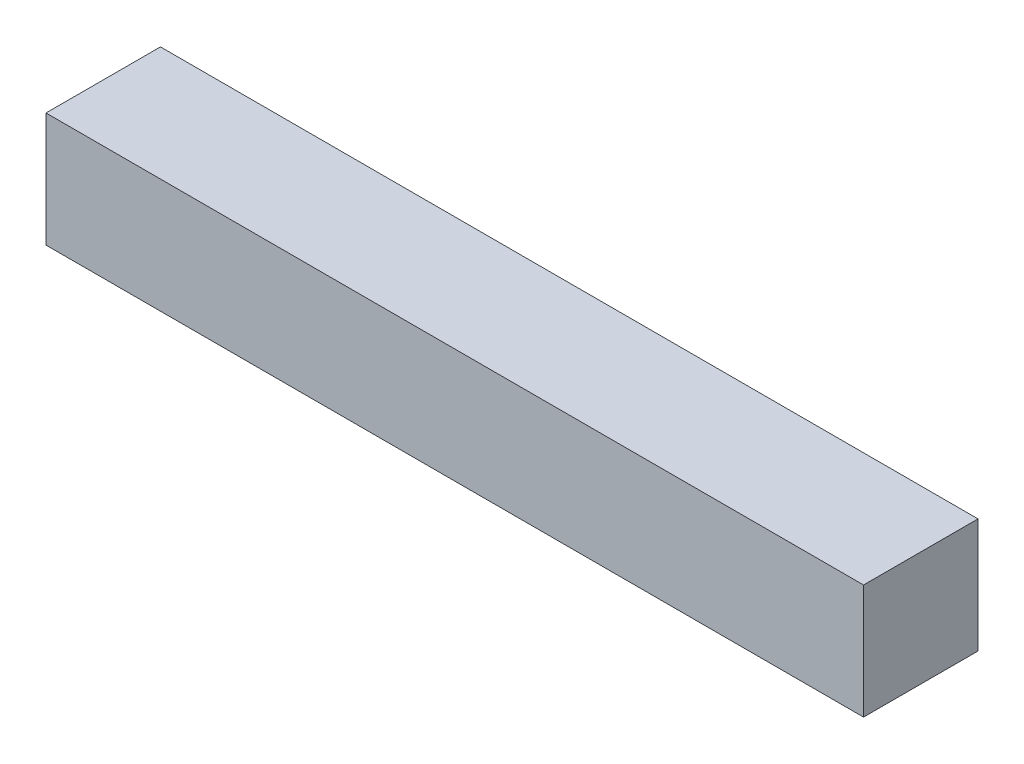
ISO-10303-21;
HEADER;
FILE_DESCRIPTION(('STEP AP214'),'2;1');
FILE_NAME('part.step','',(''),(''),'','','');
FILE_SCHEMA(('AUTOMOTIVE_DESIGN { 1 0 10303 214 1 1 1 1 }'));
ENDSEC;
DATA;
#1=APPLICATION_CONTEXT('core data for automotive mechanical design processes');
#2=APPLICATION_PROTOCOL_DEFINITION('international standard','automotive_design',2000,#1);
#3=PRODUCT_CONTEXT('',#1,'mechanical');
#4=PRODUCT('Part','Part','',(#3));
#5=PRODUCT_RELATED_PRODUCT_CATEGORY('part','',(#4));
#6=PRODUCT_DEFINITION_FORMATION('','',#4);
#7=PRODUCT_DEFINITION_CONTEXT('part definition',#1,'design');
#8=PRODUCT_DEFINITION('design','',#6,#7);
#9=PRODUCT_DEFINITION_SHAPE('','',#8);
#10=(LENGTH_UNIT() NAMED_UNIT(*) SI_UNIT(.MILLI.,.METRE.));
#11=(NAMED_UNIT(*) PLANE_ANGLE_UNIT() SI_UNIT($,.RADIAN.));
#12=(NAMED_UNIT(*) SI_UNIT($,.STERADIAN.) SOLID_ANGLE_UNIT());
#13=UNCERTAINTY_MEASURE_WITH_UNIT(LENGTH_MEASURE(1.E-05),#10,'distance_accuracy_value','');
#14=(GEOMETRIC_REPRESENTATION_CONTEXT(3) GLOBAL_UNCERTAINTY_ASSIGNED_CONTEXT((#13)) GLOBAL_UNIT_ASSIGNED_CONTEXT((#10,
#11,#12)) REPRESENTATION_CONTEXT('',''));
#15=CARTESIAN_POINT('',(0.,0.,0.));
#16=DIRECTION('',(0.,0.,1.));
#17=DIRECTION('',(1.,0.,0.));
#18=AXIS2_PLACEMENT_3D('',#15,#16,#17);
#19=CARTESIAN_POINT('',(0.,0.,0.));
#20=DIRECTION('',(0.,0.,1.));
#21=DIRECTION('',(1.,0.,0.));
#22=AXIS2_PLACEMENT_3D('',#19,#20,#21);
#23=PLANE('',#22);
#24=DIRECTION('',(0.,-1.,0.));
#25=VECTOR('',#24,1.);
#26=CARTESIAN_POINT('',(-15000.,7000.,0.));
#27=LINE('',#26,#25);
#28=CARTESIAN_POINT('',(-15000.,7000.,0.));
#29=VERTEX_POINT('',#28);
#30=CARTESIAN_POINT('',(-15000.,0.,0.));
#31=VERTEX_POINT('',#30);
#32=EDGE_CURVE('E345',#29,#31,#27,.T.);
#33=ORIENTED_EDGE('',*,*,#32,.F.);
#34=DIRECTION('',(-1.,0.,0.));
#35=VECTOR('',#34,1.);
#36=CARTESIAN_POINT('',(35000.,7000.,0.));
#37=LINE('',#36,#35);
#38=CARTESIAN_POINT('',(35000.,7000.,0.));
#39=VERTEX_POINT('',#38);
#40=EDGE_CURVE('E95',#39,#29,#37,.T.);
#41=ORIENTED_EDGE('',*,*,#40,.F.);
#42=DIRECTION('',(0.,1.,0.));
#43=VECTOR('',#42,1.);
#44=CARTESIAN_POINT('',(35000.,0.,0.));
#45=LINE('',#44,#43);
#46=CARTESIAN_POINT('',(35000.,0.,0.));
#47=VERTEX_POINT('',#46);
#48=EDGE_CURVE('E343',#47,#39,#45,.T.);
#49=ORIENTED_EDGE('',*,*,#48,.F.);
#50=DIRECTION('',(1.,0.,0.));
#51=VECTOR('',#50,1.);
#52=CARTESIAN_POINT('',(-15000.,0.,0.));
#53=LINE('',#52,#51);
#54=EDGE_CURVE('E334',#31,#47,#53,.T.);
#55=ORIENTED_EDGE('',*,*,#54,.F.);
#56=EDGE_LOOP('',(#33,#41,#49,#55));
#57=FACE_BOUND('',#56,.T.);
#58=DIRECTION('',(0.,-1.,0.));
#59=VECTOR('',#58,1.);
#60=CARTESIAN_POINT('',(99.9066587836865,800.,0.));
#61=LINE('',#60,#59);
#62=CARTESIAN_POINT('',(99.9066587836865,158.611679528378,0.));
#63=VERTEX_POINT('',#62);
#64=CARTESIAN_POINT('',(99.9066587836865,474.242430461089,0.));
#65=VERTEX_POINT('',#64);
#66=EDGE_CURVE('E11',#63,#65,#61,.F.);
#67=ORIENTED_EDGE('',*,*,#66,.F.);
#68=CARTESIAN_POINT('',(150.,300.,0.));
#69=DIRECTION('',(0.,0.,1.));
#70=DIRECTION('',(1.,0.,0.));
#71=AXIS2_PLACEMENT_3D('',#68,#69,#70);
#72=CIRCLE('',#71,150.);
#73=CARTESIAN_POINT('',(150.,150.,0.));
#74=VERTEX_POINT('',#73);
#75=EDGE_CURVE('E380',#63,#74,#72,.T.);
#76=ORIENTED_EDGE('',*,*,#75,.T.);
#77=DIRECTION('',(1.,0.,0.));
#78=VECTOR('',#77,1.);
#79=CARTESIAN_POINT('',(0.,150.,0.));
#80=LINE('',#79,#78);
#81=CARTESIAN_POINT('',(2301.451,150.,0.));
#82=VERTEX_POINT('',#81);
#83=EDGE_CURVE('E367',#74,#82,#80,.T.);
#84=ORIENTED_EDGE('',*,*,#83,.T.);
#85=DIRECTION('',(0.996896316671423,0.0787256870846496,0.));
#86=VECTOR('',#85,1.);
#87=CARTESIAN_POINT('',(2.49157854542215,-31.5506357151019,0.));
#88=LINE('',#87,#86);
#89=CARTESIAN_POINT('',(4876.20515246235,353.330362783819,0.));
#90=VERTEX_POINT('',#89);
#91=EDGE_CURVE('E370',#82,#90,#88,.T.);
#92=ORIENTED_EDGE('',*,*,#91,.T.);
#93=DIRECTION('',(0.,-1.,0.));
#94=VECTOR('',#93,1.);
#95=CARTESIAN_POINT('',(4876.20515246235,800.,0.));
#96=LINE('',#95,#94);
#97=CARTESIAN_POINT('',(4876.20515246235,393.340259861367,0.));
#98=VERTEX_POINT('',#97);
#99=EDGE_CURVE('E364',#98,#90,#96,.T.);
#100=ORIENTED_EDGE('',*,*,#99,.F.);
#101=DIRECTION('',(-0.987755867123207,0.156007522138138,0.));
#102=VECTOR('',#101,1.);
#103=CARTESIAN_POINT('',(179.291462713841,1135.1772773103,0.));
#104=LINE('',#103,#102);
#105=CARTESIAN_POINT('',(2499.002,768.799,0.));
#106=VERTEX_POINT('',#105);
#107=EDGE_CURVE('E359',#98,#106,#104,.T.);
#108=ORIENTED_EDGE('',*,*,#107,.T.);
#109=DIRECTION('',(-0.996934363430157,0.0782424118500126,0.));
#110=VECTOR('',#109,1.);
#111=CARTESIAN_POINT('',(75.2668596068133,959.021034695946,0.));
#112=LINE('',#111,#110);
#113=CARTESIAN_POINT('',(2101.451,800.,0.));
#114=VERTEX_POINT('',#113);
#115=EDGE_CURVE('E360',#106,#114,#112,.T.);
#116=ORIENTED_EDGE('',*,*,#115,.T.);
#117=DIRECTION('',(1.,0.,0.));
#118=VECTOR('',#117,1.);
#119=CARTESIAN_POINT('',(0.,800.,0.));
#120=LINE('',#119,#118);
#121=CARTESIAN_POINT('',(1551.451,800.,0.));
#122=VERTEX_POINT('',#121);
#123=EDGE_CURVE('E361',#122,#114,#120,.T.);
#124=ORIENTED_EDGE('',*,*,#123,.F.);
#125=DIRECTION('',(-0.992522376322293,-0.122062821938327,0.));
#126=VECTOR('',#125,1.);
#127=CARTESIAN_POINT('',(-73.8044813669109,600.122117990456,0.));
#128=LINE('',#127,#126);
#129=CARTESIAN_POINT('',(1255.921,763.655,0.));
#130=VERTEX_POINT('',#129);
#131=EDGE_CURVE('E203',#122,#130,#128,.T.);
#132=ORIENTED_EDGE('',*,*,#131,.T.);
#133=DIRECTION('',(-0.970201590454346,-0.242299141310607,0.));
#134=VECTOR('',#133,1.);
#135=CARTESIAN_POINT('',(-105.785555519373,423.581006754064,0.));
#136=LINE('',#135,#134);
#137=CARTESIAN_POINT('',(113.655128803409,478.384348557619,0.));
#138=VERTEX_POINT('',#137);
#139=EDGE_CURVE('E372',#130,#138,#136,.T.);
#140=ORIENTED_EDGE('',*,*,#139,.T.);
#141=CARTESIAN_POINT('',(150.,332.854109989467,0.));
#142=DIRECTION('',(0.,0.,1.));
#143=DIRECTION('',(1.,0.,0.));
#144=AXIS2_PLACEMENT_3D('',#141,#142,#143);
#145=CIRCLE('',#144,150.);
#146=EDGE_CURVE('E54',#138,#65,#145,.T.);
#147=ORIENTED_EDGE('',*,*,#146,.T.);
#148=EDGE_LOOP('',(#67,#76,#84,#92,#100,#108,#116,#124,#132,#140,#147));
#149=FACE_BOUND('',#148,.T.);
#150=ADVANCED_FACE('F50',(#57,#149),#23,.F.);
#151=CARTESIAN_POINT('',(-15000.,7000.,7000.));
#152=DIRECTION('',(1.,0.,0.));
#153=DIRECTION('',(0.,0.,-1.));
#154=AXIS2_PLACEMENT_3D('',#151,#152,#153);
#155=PLANE('',#154);
#156=ORIENTED_EDGE('',*,*,#32,.T.);
#157=DIRECTION('',(0.,0.,-1.));
#158=VECTOR('',#157,1.);
#159=CARTESIAN_POINT('',(-15000.,0.,7000.));
#160=LINE('',#159,#158);
#161=CARTESIAN_POINT('',(-15000.,0.,7000.));
#162=VERTEX_POINT('',#161);
#163=EDGE_CURVE('E339',#162,#31,#160,.T.);
#164=ORIENTED_EDGE('',*,*,#163,.F.);
#165=DIRECTION('',(0.,-1.,0.));
#166=VECTOR('',#165,1.);
#167=CARTESIAN_POINT('',(-15000.,7000.,7000.));
#168=LINE('',#167,#166);
#169=CARTESIAN_POINT('',(-15000.,7000.,7000.));
#170=VERTEX_POINT('',#169);
#171=EDGE_CURVE('E349',#170,#162,#168,.T.);
#172=ORIENTED_EDGE('',*,*,#171,.F.);
#173=DIRECTION('',(0.,0.,-1.));
#174=VECTOR('',#173,1.);
#175=CARTESIAN_POINT('',(-15000.,7000.,7000.));
#176=LINE('',#175,#174);
#177=EDGE_CURVE('E354',#170,#29,#176,.T.);
#178=ORIENTED_EDGE('',*,*,#177,.T.);
#179=EDGE_LOOP('',(#156,#164,#172,#178));
#180=FACE_BOUND('',#179,.T.);
#181=ADVANCED_FACE('F47',(#180),#155,.F.);
#182=CARTESIAN_POINT('',(-15000.,0.,7000.));
#183=DIRECTION('',(0.,1.,0.));
#184=DIRECTION('',(0.,0.,1.));
#185=AXIS2_PLACEMENT_3D('',#182,#183,#184);
#186=PLANE('',#185);
#187=ORIENTED_EDGE('',*,*,#54,.T.);
#188=DIRECTION('',(0.,0.,-1.));
#189=VECTOR('',#188,1.);
#190=CARTESIAN_POINT('',(35000.,0.,7000.));
#191=LINE('',#190,#189);
#192=CARTESIAN_POINT('',(35000.,0.,7000.));
#193=VERTEX_POINT('',#192);
#194=EDGE_CURVE('E333',#193,#47,#191,.T.);
#195=ORIENTED_EDGE('',*,*,#194,.F.);
#196=DIRECTION('',(1.,0.,0.));
#197=VECTOR('',#196,1.);
#198=CARTESIAN_POINT('',(-15000.,0.,7000.));
#199=LINE('',#198,#197);
#200=EDGE_CURVE('E99',#162,#193,#199,.T.);
#201=ORIENTED_EDGE('',*,*,#200,.F.);
#202=ORIENTED_EDGE('',*,*,#163,.T.);
#203=EDGE_LOOP('',(#187,#195,#201,#202));
#204=FACE_BOUND('',#203,.T.);
#205=ADVANCED_FACE('F318',(#204),#186,.F.);
#206=CARTESIAN_POINT('',(35000.,0.,7000.));
#207=DIRECTION('',(-1.,0.,0.));
#208=DIRECTION('',(0.,0.,1.));
#209=AXIS2_PLACEMENT_3D('',#206,#207,#208);
#210=PLANE('',#209);
#211=ORIENTED_EDGE('',*,*,#48,.T.);
#212=DIRECTION('',(0.,0.,-1.));
#213=VECTOR('',#212,1.);
#214=CARTESIAN_POINT('',(35000.,7000.,7000.));
#215=LINE('',#214,#213);
#216=CARTESIAN_POINT('',(35000.,7000.,7000.));
#217=VERTEX_POINT('',#216);
#218=EDGE_CURVE('E347',#217,#39,#215,.T.);
#219=ORIENTED_EDGE('',*,*,#218,.F.);
#220=DIRECTION('',(0.,1.,0.));
#221=VECTOR('',#220,1.);
#222=CARTESIAN_POINT('',(35000.,0.,7000.));
#223=LINE('',#222,#221);
#224=EDGE_CURVE('E344',#193,#217,#223,.T.);
#225=ORIENTED_EDGE('',*,*,#224,.F.);
#226=ORIENTED_EDGE('',*,*,#194,.T.);
#227=EDGE_LOOP('',(#211,#219,#225,#226));
#228=FACE_BOUND('',#227,.T.);
#229=ADVANCED_FACE('F330',(#228),#210,.F.);
#230=CARTESIAN_POINT('',(35000.,7000.,7000.));
#231=DIRECTION('',(0.,-1.,0.));
#232=DIRECTION('',(0.,0.,-1.));
#233=AXIS2_PLACEMENT_3D('',#230,#231,#232);
#234=PLANE('',#233);
#235=ORIENTED_EDGE('',*,*,#40,.T.);
#236=ORIENTED_EDGE('',*,*,#177,.F.);
#237=DIRECTION('',(-1.,0.,0.));
#238=VECTOR('',#237,1.);
#239=CARTESIAN_POINT('',(35000.,7000.,7000.));
#240=LINE('',#239,#238);
#241=EDGE_CURVE('E72',#217,#170,#240,.T.);
#242=ORIENTED_EDGE('',*,*,#241,.F.);
#243=ORIENTED_EDGE('',*,*,#218,.T.);
#244=EDGE_LOOP('',(#235,#236,#242,#243));
#245=FACE_BOUND('',#244,.T.);
#246=ADVANCED_FACE('F322',(#245),#234,.F.);
#247=CARTESIAN_POINT('',(0.,0.,7000.));
#248=DIRECTION('',(0.,0.,1.));
#249=DIRECTION('',(1.,0.,0.));
#250=AXIS2_PLACEMENT_3D('',#247,#248,#249);
#251=PLANE('',#250);
#252=ORIENTED_EDGE('',*,*,#171,.T.);
#253=ORIENTED_EDGE('',*,*,#200,.T.);
#254=ORIENTED_EDGE('',*,*,#224,.T.);
#255=ORIENTED_EDGE('',*,*,#241,.T.);
#256=EDGE_LOOP('',(#252,#253,#254,#255));
#257=FACE_BOUND('',#256,.T.);
#258=ADVANCED_FACE('F323',(#257),#251,.T.);
#259=CARTESIAN_POINT('',(259.906658783687,800.,0.));
#260=DIRECTION('',(0.,-1.,0.));
#261=DIRECTION('',(0.,0.,-1.));
#262=AXIS2_PLACEMENT_3D('',#259,#260,#261);
#263=CYLINDRICAL_SURFACE('',#262,160.);
#264=ORIENTED_EDGE('',*,*,#66,.T.);
#265=CARTESIAN_POINT('',(113.655128803409,478.384348557619,-64.8882884535263));
#266=CARTESIAN_POINT('',(112.773939032918,478.164232994411,-62.9022135519065));
#267=CARTESIAN_POINT('',(111.933155729284,477.945795953748,-60.8980057661391));
#268=CARTESIAN_POINT('',(110.333625202495,477.516710712539,-56.8562236105316));
#269=CARTESIAN_POINT('',(109.574880662755,477.306062766917,-54.8186481517733));
#270=CARTESIAN_POINT('',(108.140474526136,476.896935722458,-50.7124900371555));
#271=CARTESIAN_POINT('',(107.464840130629,476.698460618308,-48.6438974768202));
#272=CARTESIAN_POINT('',(106.198137658814,476.317814583302,-44.4795123289952));
#273=CARTESIAN_POINT('',(105.607068680471,476.135643478542,-42.383720031898));
#274=CARTESIAN_POINT('',(104.511164120193,475.791492586405,-38.170326894472));
#275=CARTESIAN_POINT('',(104.006242210099,475.629492630005,-36.0527501682852));
#276=CARTESIAN_POINT('',(103.082932209994,475.328755377082,-31.7971598743901));
#277=CARTESIAN_POINT('',(102.66454431668,475.190018133439,-29.6591462602389));
#278=CARTESIAN_POINT('',(101.915268820844,474.938644041753,-25.3666448290491));
#279=CARTESIAN_POINT('',(101.58436782491,474.826003198927,-23.2121595856826));
#280=CARTESIAN_POINT('',(101.010740244002,474.629088177567,-18.8901866979926));
#281=CARTESIAN_POINT('',(100.768013552683,474.544813964819,-16.7226990693543));
#282=CARTESIAN_POINT('',(100.37076423608,474.406161867699,-12.3726224328995));
#283=CARTESIAN_POINT('',(100.21648827366,474.351867603903,-10.1900082088244));
#284=CARTESIAN_POINT('',(99.9975671230742,474.274653761924,-5.8197269539753));
#285=CARTESIAN_POINT('',(99.9329221235669,474.251734249778,-3.6320599125758));
#286=CARTESIAN_POINT('',(99.8934242819721,474.237742403755,0.744450738233998));
#287=CARTESIAN_POINT('',(99.9185822486834,474.246673903504,2.93329445756778));
#288=CARTESIAN_POINT('',(100.058650209219,474.296207977458,7.30773390133307));
#289=CARTESIAN_POINT('',(100.173559683034,474.336810368165,9.49332964450949));
#290=CARTESIAN_POINT('',(100.492693380218,474.448796061191,13.8551440212282));
#291=CARTESIAN_POINT('',(100.696834271621,474.520150643601,16.0313694952312));
#292=CARTESIAN_POINT('',(101.193919943739,474.692171407193,20.3725274347643));
#293=CARTESIAN_POINT('',(101.486866629951,474.792838217323,22.5374596569623));
#294=CARTESIAN_POINT('',(102.16078590948,475.021392150112,26.8515295793954));
#295=CARTESIAN_POINT('',(102.541734866669,475.149271963028,29.0006713610749));
#296=CARTESIAN_POINT('',(103.390811659426,475.429645345374,33.2798357862657));
#297=CARTESIAN_POINT('',(103.8589325439,475.582136952128,35.4098599400322));
#298=CARTESIAN_POINT('',(104.936939869616,475.926381416005,39.8776210107061));
#299=CARTESIAN_POINT('',(105.556701493798,476.120599632764,42.2127912998076));
#300=CARTESIAN_POINT('',(106.900536974426,476.5305848942,46.8503359801782));
#301=CARTESIAN_POINT('',(107.624586121608,476.746346830732,49.1527179985066));
#302=CARTESIAN_POINT('',(109.174416422244,477.193713901137,53.7177097487012));
#303=CARTESIAN_POINT('',(110.000046911566,477.425295350108,55.9803728286771));
#304=CARTESIAN_POINT('',(111.314153213711,477.78033591011,59.3440574899915));
#305=CARTESIAN_POINT('',(111.764862264654,477.899976882307,60.4603772225236));
#306=CARTESIAN_POINT('',(112.691287391964,478.141029180627,62.6823991134769));
#307=CARTESIAN_POINT('',(113.167003475438,478.262440507252,63.7881012688804));
#308=CARTESIAN_POINT('',(113.655128803409,478.384348557619,64.8882884535263));
#309=B_SPLINE_CURVE_WITH_KNOTS('',3,(#265,#266,#267,#268,#269,#270,#271,#272,#273,#274,#275,
#276,#277,#278,#279,#280,#281,#282,#283,#284,#285,#286,#287,#288,#289,#290,#291,#292,#293,#294,
#295,#296,#297,#298,#299,#300,#301,#302,#303,#304,#305,#306,#307,#308),.UNSPECIFIED.,.F.,.F.,(4,
2,2,2,2,2,2,2,2,2,2,2,2,2,2,2,2,2,2,2,2,4),(0.,6.55129299468972,13.1028002115112,
19.6564460177392,26.2100219127685,32.7569913826109,39.3039757340479,45.849957223369,
52.3959308176641,58.9600714939326,65.5242259865694,72.089170575798,78.6540771287231,
85.2128658627705,91.7717953380148,98.3289652243589,104.885612465355,112.154383970393,
119.421436080517,126.677836867381,130.306981102657,133.936126369311),.UNSPECIFIED.);
#310=CARTESIAN_POINT('',(113.655128803409,478.384348557619,64.8882884535251));
#311=VERTEX_POINT('',#310);
#312=EDGE_CURVE('E248',#65,#311,#309,.T.);
#313=ORIENTED_EDGE('',*,*,#312,.T.);
#314=CARTESIAN_POINT('',(259.906658783687,514.909355812027,0.));
#315=DIRECTION('',(-0.242299141310607,0.970201590454346,0.));
#316=DIRECTION('',(-0.970201590454346,-0.242299141310607,0.));
#317=AXIS2_PLACEMENT_3D('',#314,#315,#316);
#318=ELLIPSE('',#317,164.914180283988,160.);
#319=CARTESIAN_POINT('',(161.409759474517,490.310639051325,126.088702215857));
#320=VERTEX_POINT('',#319);
#321=EDGE_CURVE('E387',#311,#320,#318,.T.);
#322=ORIENTED_EDGE('',*,*,#321,.T.);
#323=DIRECTION('',(0.,-1.,0.));
#324=VECTOR('',#323,1.);
#325=CARTESIAN_POINT('',(161.409759474516,800.,126.088702215857));
#326=LINE('',#325,#324);
#327=CARTESIAN_POINT('',(161.409759474516,150.,126.088702215857));
#328=VERTEX_POINT('',#327);
#329=EDGE_CURVE('E244',#320,#328,#326,.T.);
#330=ORIENTED_EDGE('',*,*,#329,.T.);
#331=CARTESIAN_POINT('',(259.906658783687,150.,0.));
#332=DIRECTION('',(0.,-1.,0.));
#333=DIRECTION('',(0.,0.,-1.));
#334=AXIS2_PLACEMENT_3D('',#331,#332,#333);
#335=CIRCLE('',#334,160.);
#336=CARTESIAN_POINT('',(150.,150.,116.277798203296));
#337=VERTEX_POINT('',#336);
#338=EDGE_CURVE('E407',#328,#337,#335,.T.);
#339=ORIENTED_EDGE('',*,*,#338,.T.);
#340=CARTESIAN_POINT('',(150.,150.,116.277798203296));
#341=CARTESIAN_POINT('',(149.197227518988,150.000000444739,115.519013001234));
#342=CARTESIAN_POINT('',(148.402349323817,150.006444551494,114.751945115754));
#343=CARTESIAN_POINT('',(146.828761077162,150.031461689993,113.201629596887));
#344=CARTESIAN_POINT('',(146.050050642098,150.050034433644,112.418382348238));
#345=CARTESIAN_POINT('',(143.738992605803,150.122798834219,110.045212540939));
#346=CARTESIAN_POINT('',(142.231396084721,150.194037269926,108.43155736251));
#347=CARTESIAN_POINT('',(139.286546373212,150.375814699117,105.145862331909));
#348=CARTESIAN_POINT('',(137.849239225862,150.486322991144,103.473869007217));
#349=CARTESIAN_POINT('',(135.046053340973,150.740627964951,100.073395601841));
#350=CARTESIAN_POINT('',(133.68017721911,150.884425864692,98.3449134563993));
#351=CARTESIAN_POINT('',(131.023003065829,151.199252798717,94.8358771461094));
#352=CARTESIAN_POINT('',(129.731654200361,151.37026296545,93.0553597529595));
#353=CARTESIAN_POINT('',(127.224251842487,151.733785604688,89.4439038255723));
#354=CARTESIAN_POINT('',(126.008207640174,151.926300722009,87.6129591103741));
#355=CARTESIAN_POINT('',(123.653075843413,152.327163170553,83.903449669022));
#356=CARTESIAN_POINT('',(122.514002675644,152.535513454298,82.0248761060328));
#357=CARTESIAN_POINT('',(120.314753352958,152.962451132073,78.2235331504458));
#358=CARTESIAN_POINT('',(119.254568306852,153.181037367909,76.3007687705009));
#359=CARTESIAN_POINT('',(117.216364660646,153.622684269366,72.4173979297617));
#360=CARTESIAN_POINT('',(116.238193444443,153.84573562226,70.4568704991598));
#361=CARTESIAN_POINT('',(114.363161419552,154.291577394139,66.4972847107507));
#362=CARTESIAN_POINT('',(113.466300511938,154.514367813441,64.4982263998262));
#363=CARTESIAN_POINT('',(111.755279479412,154.954759642745,60.464600680722));
#364=CARTESIAN_POINT('',(110.941114441265,155.172361360436,58.4300353905561));
#365=CARTESIAN_POINT('',(109.396721623774,155.597730716471,54.3282724139933));
#366=CARTESIAN_POINT('',(108.666493845211,155.805498354724,52.2610747272926));
#367=CARTESIAN_POINT('',(107.291517437633,156.206751675774,48.0980446572108));
#368=CARTESIAN_POINT('',(106.646732773703,156.400243363975,46.0022247590141));
#369=CARTESIAN_POINT('',(105.443470641596,156.769026649784,41.784363149105));
#370=CARTESIAN_POINT('',(104.884993033115,156.944318276979,39.6623214800257));
#371=CARTESIAN_POINT('',(103.855447732851,157.273084547455,35.3954250788466));
#372=CARTESIAN_POINT('',(103.384381074604,157.426558932767,33.2505700773215));
#373=CARTESIAN_POINT('',(102.530668116976,157.708522147084,28.9416891731522));
#374=CARTESIAN_POINT('',(102.148022100941,157.837010896023,26.7776632090972));
#375=CARTESIAN_POINT('',(101.465667462759,158.068499170636,22.3934355301932));
#376=CARTESIAN_POINT('',(101.16765188495,158.170974528566,20.1729421971747));
#377=CARTESIAN_POINT('',(100.665032437988,158.345025688778,15.7201891996206));
#378=CARTESIAN_POINT('',(100.460428869546,158.416601391587,13.4879294972302));
#379=CARTESIAN_POINT('',(100.145158117363,158.527307591484,9.01595322708888));
#380=CARTESIAN_POINT('',(100.034491923749,158.566437746585,6.77623658098935));
#381=CARTESIAN_POINT('',(99.9073913706489,158.611403854638,2.29379848782876));
#382=CARTESIAN_POINT('',(99.890956852716,158.617239863573,0.0510770458265141));
#383=CARTESIAN_POINT('',(99.9523649444744,158.595490600866,-4.43306367901725));
#384=CARTESIAN_POINT('',(100.030213962676,158.567903057404,-6.67448286298269));
#385=CARTESIAN_POINT('',(100.279994263522,158.479900598214,-11.1514286514722));
#386=CARTESIAN_POINT('',(100.45192582509,158.419485585163,-13.3869552385069));
#387=CARTESIAN_POINT('',(100.889419452544,158.267136953808,-17.8476868417839));
#388=CARTESIAN_POINT('',(101.154979400206,158.175204048558,-20.0728920903795));
#389=CARTESIAN_POINT('',(101.779063595891,157.961800844771,-24.5087784389172));
#390=CARTESIAN_POINT('',(102.137587017684,157.840330808752,-26.7194596677651));
#391=CARTESIAN_POINT('',(102.926775780276,157.577123600622,-31.013612685877));
#392=CARTESIAN_POINT('',(103.353010132429,157.436681731273,-33.097980323524));
#393=CARTESIAN_POINT('',(104.287844992139,157.134188084224,-37.2465553021806));
#394=CARTESIAN_POINT('',(104.796444743854,156.972136504832,-39.3107628280093));
#395=CARTESIAN_POINT('',(105.895018848793,156.629565097021,-43.4157709760835));
#396=CARTESIAN_POINT('',(106.484990458811,156.449045891235,-45.4565723848841));
#397=CARTESIAN_POINT('',(107.745269602171,156.073038938233,-49.5118169088477));
#398=CARTESIAN_POINT('',(108.415577358716,155.87755114943,-51.5262599507604));
#399=CARTESIAN_POINT('',(109.835448832084,155.475423435206,-55.5259909350783));
#400=CARTESIAN_POINT('',(110.585016389714,155.268782969582,-57.5112774592899));
#401=CARTESIAN_POINT('',(112.16222299892,154.848463183412,-61.4498304520931));
#402=CARTESIAN_POINT('',(112.989862077777,154.634783860406,-63.4030969094955));
#403=CARTESIAN_POINT('',(114.722056314859,154.204722154663,-67.2750290342799));
#404=CARTESIAN_POINT('',(115.626615162842,153.988339642681,-69.1936930364625));
#405=CARTESIAN_POINT('',(117.511377819577,153.557438268491,-72.9937124329084));
#406=CARTESIAN_POINT('',(118.491581457163,153.342919402067,-74.8750679115794));
#407=CARTESIAN_POINT('',(120.50777368734,152.924342060301,-78.5639102097275));
#408=CARTESIAN_POINT('',(121.542417530248,152.72016412512,-80.3721185349167));
#409=CARTESIAN_POINT('',(123.682199302699,152.32279256364,-83.9478298250324));
#410=CARTESIAN_POINT('',(124.787344283253,152.129600039689,-85.71532869436));
#411=CARTESIAN_POINT('',(127.066448812287,151.759031112758,-89.2066346063971));
#412=CARTESIAN_POINT('',(128.240395586125,151.581651789015,-90.93044967541));
#413=CARTESIAN_POINT('',(130.655656175891,151.247580067016,-94.3320138856591));
#414=CARTESIAN_POINT('',(131.896962496124,151.090885373631,-96.0097681213311));
#415=CARTESIAN_POINT('',(134.446592080053,150.803019950715,-99.3183641400926));
#416=CARTESIAN_POINT('',(135.754977031146,150.671873267667,-100.949160506855));
#417=CARTESIAN_POINT('',(138.435759352656,150.44038541193,-104.159463428637));
#418=CARTESIAN_POINT('',(139.80815467633,150.340043255038,-105.73897162087));
#419=CARTESIAN_POINT('',(142.615869629206,150.1752575045,-108.845099188879));
#420=CARTESIAN_POINT('',(144.051233647806,150.110839688822,-110.371679851087));
#421=CARTESIAN_POINT('',(146.981580403563,150.023207631752,-113.368082399426));
#422=CARTESIAN_POINT('',(148.476570551277,149.999998528351,-114.83789718552));
#423=CARTESIAN_POINT('',(150.,150.,-116.277798203296));
#424=B_SPLINE_CURVE_WITH_KNOTS('',3,(#340,#341,#342,#343,#344,#345,#346,#347,#348,#349,#350,
#351,#352,#353,#354,#355,#356,#357,#358,#359,#360,#361,#362,#363,#364,#365,#366,#367,#368,#369,
#370,#371,#372,#373,#374,#375,#376,#377,#378,#379,#380,#381,#382,#383,#384,#385,#386,#387,#388,
#389,#390,#391,#392,#393,#394,#395,#396,#397,#398,#399,#400,#401,#402,#403,#404,#405,#406,#407,
#408,#409,#410,#411,#412,#413,#414,#415,#416,#417,#418,#419,#420,#421,#422,#423),.UNSPECIFIED.,
.F.,.F.,(4,2,2,2,2,2,2,2,2,2,2,2,2,2,2,2,2,2,2,2,2,2,2,2,2,2,2,2,2,2,2,2,2,2,2,2,2,2,2,2,2,4),
(0.,3.31371001652165,6.6273413252176,13.2532751900694,19.8740402078589,26.4950474965277,
33.1114839710399,39.7287350744754,46.3472230285733,52.9649639039089,59.5701033647869,
66.1752347893612,72.7799735513195,79.3847123747196,85.9866567792438,92.5885904512923,
99.1906021788814,105.792635062468,112.518689760155,119.244766110194,125.970913354141,
132.697049288266,139.42364242767,146.150255509359,152.876716419738,159.6031175495,
165.997719115792,172.392262004002,178.786589372256,185.180934506686,191.57558964331,
197.970247014477,204.365211303699,210.760161123149,217.03838877844,223.317245323713,
229.594939724959,235.871936978217,242.154814065331,248.437490393972,254.72466915517,
261.012631760361),.UNSPECIFIED.);
#425=EDGE_CURVE('E254',#337,#63,#424,.T.);
#426=ORIENTED_EDGE('',*,*,#425,.T.);
#427=EDGE_LOOP('',(#264,#313,#322,#330,#339,#426));
#428=FACE_BOUND('',#427,.T.);
#429=ADVANCED_FACE('F265',(#428),#263,.F.);
#430=CARTESIAN_POINT('',(4846.20515246235,800.,0.));
#431=DIRECTION('',(0.,-1.,0.));
#432=DIRECTION('',(0.,0.,-1.));
#433=AXIS2_PLACEMENT_3D('',#430,#431,#432);
#434=CYLINDRICAL_SURFACE('',#433,30.);
#435=ORIENTED_EDGE('',*,*,#99,.T.);
#436=CARTESIAN_POINT('',(4846.20515246235,350.96123916179,0.));
#437=DIRECTION('',(0.0787256870846496,-0.996896316671423,0.));
#438=DIRECTION('',(-0.996896316671423,-0.0787256870846496,0.));
#439=AXIS2_PLACEMENT_3D('',#436,#437,#438);
#440=ELLIPSE('',#439,30.0934003850756,30.);
#441=CARTESIAN_POINT('',(4854.87610310538,351.645990961585,28.719585911815));
#442=VERTEX_POINT('',#441);
#443=EDGE_CURVE('E416',#90,#442,#440,.T.);
#444=ORIENTED_EDGE('',*,*,#443,.T.);
#445=DIRECTION('',(0.,-1.,0.));
#446=VECTOR('',#445,1.);
#447=CARTESIAN_POINT('',(4854.87610310538,800.,28.719585911815));
#448=LINE('',#447,#446);
#449=CARTESIAN_POINT('',(4854.87610310538,396.708999294354,28.719585911815));
#450=VERTEX_POINT('',#449);
#451=EDGE_CURVE('E224',#450,#442,#448,.T.);
#452=ORIENTED_EDGE('',*,*,#451,.F.);
#453=CARTESIAN_POINT('',(4846.20515246235,398.078501181841,0.));
#454=DIRECTION('',(0.156007522138138,0.987755867123207,0.));
#455=DIRECTION('',(0.987755867123207,-0.156007522138138,0.));
#456=AXIS2_PLACEMENT_3D('',#453,#454,#455);
#457=ELLIPSE('',#456,30.3718773013962,30.);
#458=EDGE_CURVE('E422',#450,#98,#457,.T.);
#459=ORIENTED_EDGE('',*,*,#458,.T.);
#460=EDGE_LOOP('',(#435,#444,#452,#459));
#461=FACE_BOUND('',#460,.T.);
#462=ADVANCED_FACE('F284',(#461),#434,.F.);
#463=CARTESIAN_POINT('',(4846.20515246235,800.,0.));
#464=DIRECTION('',(0.,-1.,0.));
#465=DIRECTION('',(0.,0.,-1.));
#466=AXIS2_PLACEMENT_3D('',#463,#464,#465);
#467=PLANE('',#466);
#468=ORIENTED_EDGE('',*,*,#123,.T.);
#469=DIRECTION('',(0.,0.,1.));
#470=VECTOR('',#469,1.);
#471=CARTESIAN_POINT('',(2101.451,800.,-800.));
#472=LINE('',#471,#470);
#473=CARTESIAN_POINT('',(2101.451,800.,784.57878135935));
#474=VERTEX_POINT('',#473);
#475=EDGE_CURVE('E65',#114,#474,#472,.T.);
#476=ORIENTED_EDGE('',*,*,#475,.T.);
#477=DIRECTION('',(0.989272274699699,0.,-0.146083423120088));
#478=VECTOR('',#477,1.);
#479=CARTESIAN_POINT('',(2590.582,800.,712.35));
#480=LINE('',#479,#478);
#481=CARTESIAN_POINT('',(1997.019,800.,800.));
#482=VERTEX_POINT('',#481);
#483=EDGE_CURVE('E219',#482,#474,#480,.T.);
#484=ORIENTED_EDGE('',*,*,#483,.F.);
#485=DIRECTION('',(1.,0.,0.));
#486=VECTOR('',#485,1.);
#487=CARTESIAN_POINT('',(1997.019,800.,800.));
#488=LINE('',#487,#486);
#489=CARTESIAN_POINT('',(1551.451,800.,800.));
#490=VERTEX_POINT('',#489);
#491=EDGE_CURVE('E211',#490,#482,#488,.T.);
#492=ORIENTED_EDGE('',*,*,#491,.F.);
#493=DIRECTION('',(0.,0.,1.));
#494=VECTOR('',#493,1.);
#495=CARTESIAN_POINT('',(1551.451,800.,-800.));
#496=LINE('',#495,#494);
#497=EDGE_CURVE('E191',#122,#490,#496,.T.);
#498=ORIENTED_EDGE('',*,*,#497,.F.);
#499=EDGE_LOOP('',(#468,#476,#484,#492,#498));
#500=FACE_BOUND('',#499,.T.);
#501=ADVANCED_FACE('F217',(#500),#467,.T.);
#502=CARTESIAN_POINT('',(113.655128803409,478.384348557619,-800.));
#503=DIRECTION('',(-0.242299141310607,0.970201590454346,0.));
#504=DIRECTION('',(-0.970201590454346,-0.242299141310607,0.));
#505=AXIS2_PLACEMENT_3D('',#502,#503,#504);
#506=PLANE('',#505);
#507=DIRECTION('',(0.,0.,1.));
#508=VECTOR('',#507,1.);
#509=CARTESIAN_POINT('',(1255.921,763.655,-800.));
#510=LINE('',#509,#508);
#511=CARTESIAN_POINT('',(1255.921,763.655,774.339123964959));
#512=VERTEX_POINT('',#511);
#513=EDGE_CURVE('E389',#130,#512,#510,.T.);
#514=ORIENTED_EDGE('',*,*,#513,.T.);
#515=DIRECTION('',(0.956308883695465,0.238829562460936,0.168623127298276));
#516=VECTOR('',#515,1.);
#517=CARTESIAN_POINT('',(1401.45104302585,799.999822361657,800.000007586622));
#518=LINE('',#517,#516);
#519=CARTESIAN_POINT('',(1076.464,718.837224570654,742.696));
#520=VERTEX_POINT('',#519);
#521=EDGE_CURVE('E400',#520,#512,#518,.T.);
#522=ORIENTED_EDGE('',*,*,#521,.F.);
#523=DIRECTION('',(0.890658508940707,0.222433970466134,0.396548293697232));
#524=VECTOR('',#523,1.);
#525=CARTESIAN_POINT('',(1092.5433772675,722.852904758212,749.85502846617));
#526=LINE('',#525,#524);
#527=CARTESIAN_POINT('',(784.13,645.82943126996,612.54));
#528=VERTEX_POINT('',#527);
#529=EDGE_CURVE('E401',#528,#520,#526,.T.);
#530=ORIENTED_EDGE('',*,*,#529,.F.);
#531=DIRECTION('',(0.773221678679863,0.193105175903845,0.604018730387262));
#532=VECTOR('',#531,1.);
#533=CARTESIAN_POINT('',(807.149686821474,651.578391491176,630.522323040345));
#534=LINE('',#533,#532);
#535=EDGE_CURVE('E399',#320,#528,#534,.T.);
#536=ORIENTED_EDGE('',*,*,#535,.F.);
#537=ORIENTED_EDGE('',*,*,#321,.F.);
#538=DIRECTION('',(0.,0.,1.));
#539=VECTOR('',#538,1.);
#540=CARTESIAN_POINT('',(113.655128803409,478.384348557619,-800.));
#541=LINE('',#540,#539);
#542=EDGE_CURVE('E382',#138,#311,#541,.T.);
#543=ORIENTED_EDGE('',*,*,#542,.F.);
#544=ORIENTED_EDGE('',*,*,#139,.F.);
#545=EDGE_LOOP('',(#514,#522,#530,#536,#537,#543,#544));
#546=FACE_BOUND('',#545,.T.);
#547=ADVANCED_FACE('F274',(#546),#506,.F.);
#548=CARTESIAN_POINT('',(1255.921,763.655,-800.));
#549=DIRECTION('',(-0.122062821938327,0.992522376322293,0.));
#550=DIRECTION('',(-0.992522376322293,-0.122062821938327,0.));
#551=AXIS2_PLACEMENT_3D('',#548,#549,#550);
#552=PLANE('',#551);
#553=ORIENTED_EDGE('',*,*,#497,.T.);
#554=DIRECTION('',(-0.992522376322293,-0.122062821938327,0.));
#555=VECTOR('',#554,1.);
#556=CARTESIAN_POINT('',(1255.921,763.655,800.));
#557=LINE('',#556,#555);
#558=CARTESIAN_POINT('',(1401.451,781.55263425033,800.));
#559=VERTEX_POINT('',#558);
#560=EDGE_CURVE('E197',#490,#559,#557,.T.);
#561=ORIENTED_EDGE('',*,*,#560,.T.);
#562=DIRECTION('',(0.977663361324776,0.120235424042734,0.172388499408761));
#563=VECTOR('',#562,1.);
#564=CARTESIAN_POINT('',(1403.61948357921,781.819319648382,800.382362319179));
#565=LINE('',#564,#563);
#566=EDGE_CURVE('E406',#512,#559,#565,.T.);
#567=ORIENTED_EDGE('',*,*,#566,.F.);
#568=ORIENTED_EDGE('',*,*,#513,.F.);
#569=ORIENTED_EDGE('',*,*,#131,.F.);
#570=EDGE_LOOP('',(#553,#561,#567,#568,#569));
#571=FACE_BOUND('',#570,.T.);
#572=ADVANCED_FACE('F194',(#571),#552,.F.);
#573=CARTESIAN_POINT('',(150.,332.854109989467,-800.));
#574=DIRECTION('',(0.,0.,1.));
#575=DIRECTION('',(1.,0.,0.));
#576=AXIS2_PLACEMENT_3D('',#573,#574,#575);
#577=CYLINDRICAL_SURFACE('',#576,150.);
#578=ORIENTED_EDGE('',*,*,#542,.T.);
#579=ORIENTED_EDGE('',*,*,#312,.F.);
#580=ORIENTED_EDGE('',*,*,#146,.F.);
#581=EDGE_LOOP('',(#578,#579,#580));
#582=FACE_BOUND('',#581,.T.);
#583=ADVANCED_FACE('F266',(#582),#577,.F.);
#584=CARTESIAN_POINT('',(2301.451,150.,-800.));
#585=DIRECTION('',(0.,-1.,0.));
#586=DIRECTION('',(0.,0.,-1.));
#587=AXIS2_PLACEMENT_3D('',#584,#585,#586);
#588=PLANE('',#587);
#589=DIRECTION('',(0.,0.,1.));
#590=VECTOR('',#589,1.);
#591=CARTESIAN_POINT('',(150.,150.,-800.));
#592=LINE('',#591,#590);
#593=EDGE_CURVE('E390',#74,#337,#592,.T.);
#594=ORIENTED_EDGE('',*,*,#593,.T.);
#595=ORIENTED_EDGE('',*,*,#338,.F.);
#596=DIRECTION('',(-0.788054388849103,0.,-0.615605620682322));
#597=VECTOR('',#596,1.);
#598=CARTESIAN_POINT('',(784.13,150.,612.54));
#599=LINE('',#598,#597);
#600=CARTESIAN_POINT('',(784.13,150.,612.54));
#601=VERTEX_POINT('',#600);
#602=EDGE_CURVE('E408',#601,#328,#599,.T.);
#603=ORIENTED_EDGE('',*,*,#602,.F.);
#604=DIRECTION('',(-0.913544856728147,0.,-0.406737992749078));
#605=VECTOR('',#604,1.);
#606=CARTESIAN_POINT('',(1076.464,150.,742.696));
#607=LINE('',#606,#605);
#608=CARTESIAN_POINT('',(1076.464,150.,742.696));
#609=VERTEX_POINT('',#608);
#610=EDGE_CURVE('E412',#609,#601,#607,.T.);
#611=ORIENTED_EDGE('',*,*,#610,.F.);
#612=DIRECTION('',(-0.98480774082361,0.,-0.173648246791891));
#613=VECTOR('',#612,1.);
#614=CARTESIAN_POINT('',(1401.451,150.,800.));
#615=LINE('',#614,#613);
#616=CARTESIAN_POINT('',(1401.451,150.,800.));
#617=VERTEX_POINT('',#616);
#618=EDGE_CURVE('E415',#617,#609,#615,.T.);
#619=ORIENTED_EDGE('',*,*,#618,.F.);
#620=DIRECTION('',(1.,0.,0.));
#621=VECTOR('',#620,1.);
#622=CARTESIAN_POINT('',(2301.451,150.,800.));
#623=LINE('',#622,#621);
#624=CARTESIAN_POINT('',(1997.019,150.,800.));
#625=VERTEX_POINT('',#624);
#626=EDGE_CURVE('E214',#617,#625,#623,.T.);
#627=ORIENTED_EDGE('',*,*,#626,.T.);
#628=DIRECTION('',(-0.989272274699699,0.,0.146083423120088));
#629=VECTOR('',#628,1.);
#630=CARTESIAN_POINT('',(2590.582,150.,712.35));
#631=LINE('',#630,#629);
#632=CARTESIAN_POINT('',(2301.451,150.,755.045269331141));
#633=VERTEX_POINT('',#632);
#634=EDGE_CURVE('E397',#633,#625,#631,.T.);
#635=ORIENTED_EDGE('',*,*,#634,.F.);
#636=DIRECTION('',(0.,0.,1.));
#637=VECTOR('',#636,1.);
#638=CARTESIAN_POINT('',(2301.451,150.,-800.));
#639=LINE('',#638,#637);
#640=EDGE_CURVE('E388',#82,#633,#639,.T.);
#641=ORIENTED_EDGE('',*,*,#640,.F.);
#642=ORIENTED_EDGE('',*,*,#83,.F.);
#643=EDGE_LOOP('',(#594,#595,#603,#611,#619,#627,#635,#641,#642));
#644=FACE_BOUND('',#643,.T.);
#645=ADVANCED_FACE('F269',(#644),#588,.F.);
#646=CARTESIAN_POINT('',(4950.,359.158,-800.));
#647=DIRECTION('',(0.0787256870846496,-0.996896316671423,0.));
#648=DIRECTION('',(0.996896316671423,0.0787256870846496,0.));
#649=AXIS2_PLACEMENT_3D('',#646,#647,#648);
#650=PLANE('',#649);
#651=ORIENTED_EDGE('',*,*,#640,.T.);
#652=DIRECTION('',(-0.986267111776523,-0.0778862904046533,0.145639658043396));
#653=VECTOR('',#652,1.);
#654=CARTESIAN_POINT('',(2638.75889840959,176.637470333965,705.235834956693));
#655=LINE('',#654,#653);
#656=CARTESIAN_POINT('',(2590.582,172.832902732025,712.35));
#657=VERTEX_POINT('',#656);
#658=EDGE_CURVE('E425',#657,#633,#655,.T.);
#659=ORIENTED_EDGE('',*,*,#658,.F.);
#660=DIRECTION('',(-0.954595468747509,-0.0753851558163702,0.28820924573869));
#661=VECTOR('',#660,1.);
#662=CARTESIAN_POINT('',(4887.14070143258,354.193951696659,18.9783333578475));
#663=LINE('',#662,#661);
#664=EDGE_CURVE('E419',#442,#657,#663,.T.);
#665=ORIENTED_EDGE('',*,*,#664,.F.);
#666=ORIENTED_EDGE('',*,*,#443,.F.);
#667=ORIENTED_EDGE('',*,*,#91,.F.);
#668=EDGE_LOOP('',(#651,#659,#665,#666,#667));
#669=FACE_BOUND('',#668,.T.);
#670=ADVANCED_FACE('F438',(#669),#650,.F.);
#671=CARTESIAN_POINT('',(150.,300.,-800.));
#672=DIRECTION('',(0.,0.,1.));
#673=DIRECTION('',(1.,0.,0.));
#674=AXIS2_PLACEMENT_3D('',#671,#672,#673);
#675=CYLINDRICAL_SURFACE('',#674,150.);
#676=ORIENTED_EDGE('',*,*,#425,.F.);
#677=ORIENTED_EDGE('',*,*,#593,.F.);
#678=ORIENTED_EDGE('',*,*,#75,.F.);
#679=EDGE_LOOP('',(#676,#677,#678));
#680=FACE_BOUND('',#679,.T.);
#681=ADVANCED_FACE('F275',(#680),#675,.F.);
#682=CARTESIAN_POINT('',(2499.002,768.799,-800.));
#683=DIRECTION('',(0.156007522138138,0.987755867123207,0.));
#684=DIRECTION('',(-0.987755867123207,0.156007522138138,0.));
#685=AXIS2_PLACEMENT_3D('',#682,#683,#684);
#686=PLANE('',#685);
#687=ORIENTED_EDGE('',*,*,#458,.F.);
#688=DIRECTION('',(0.946560750343431,-0.149501108653882,-0.285783422228339));
#689=VECTOR('',#688,1.);
#690=CARTESIAN_POINT('',(4797.80563476939,405.722787669301,45.9501690976439));
#691=LINE('',#690,#689);
#692=CARTESIAN_POINT('',(2590.582,754.334728662365,712.35));
#693=VERTEX_POINT('',#692);
#694=EDGE_CURVE('E223',#693,#450,#691,.T.);
#695=ORIENTED_EDGE('',*,*,#694,.F.);
#696=DIRECTION('',(0.977413355476638,-0.15437401160343,-0.144332245452509));
#697=VECTOR('',#696,1.);
#698=CARTESIAN_POINT('',(2583.69169412628,755.422993062418,713.367474656998));
#699=LINE('',#698,#697);
#700=CARTESIAN_POINT('',(2499.002,768.799,725.873395157717));
#701=VERTEX_POINT('',#700);
#702=EDGE_CURVE('E222',#701,#693,#699,.T.);
#703=ORIENTED_EDGE('',*,*,#702,.F.);
#704=DIRECTION('',(0.,0.,1.));
#705=VECTOR('',#704,1.);
#706=CARTESIAN_POINT('',(2499.002,768.799,-800.));
#707=LINE('',#706,#705);
#708=EDGE_CURVE('E206',#106,#701,#707,.T.);
#709=ORIENTED_EDGE('',*,*,#708,.F.);
#710=ORIENTED_EDGE('',*,*,#107,.F.);
#711=EDGE_LOOP('',(#687,#695,#703,#709,#710));
#712=FACE_BOUND('',#711,.T.);
#713=ADVANCED_FACE('F309',(#712),#686,.F.);
#714=CARTESIAN_POINT('',(2101.451,800.,-800.));
#715=DIRECTION('',(0.0782424118500126,0.996934363430157,0.));
#716=DIRECTION('',(-0.996934363430157,0.0782424118500126,0.));
#717=AXIS2_PLACEMENT_3D('',#714,#715,#716);
#718=PLANE('',#717);
#719=ORIENTED_EDGE('',*,*,#708,.T.);
#720=DIRECTION('',(0.986303954422834,-0.0774081053297486,-0.145645098507086));
#721=VECTOR('',#720,1.);
#722=CARTESIAN_POINT('',(2587.65111982318,761.841550043635,712.782795924778));
#723=LINE('',#722,#721);
#724=EDGE_CURVE('E202',#474,#701,#723,.T.);
#725=ORIENTED_EDGE('',*,*,#724,.F.);
#726=ORIENTED_EDGE('',*,*,#475,.F.);
#727=ORIENTED_EDGE('',*,*,#115,.F.);
#728=EDGE_LOOP('',(#719,#725,#726,#727));
#729=FACE_BOUND('',#728,.T.);
#730=ADVANCED_FACE('F308',(#729),#718,.F.);
#731=CARTESIAN_POINT('',(784.13,800.,612.54));
#732=DIRECTION('',(0.615605620682322,0.,-0.788054388849103));
#733=DIRECTION('',(-0.788054388849103,0.,-0.615605620682322));
#734=AXIS2_PLACEMENT_3D('',#731,#732,#733);
#735=PLANE('',#734);
#736=ORIENTED_EDGE('',*,*,#602,.T.);
#737=ORIENTED_EDGE('',*,*,#329,.F.);
#738=ORIENTED_EDGE('',*,*,#535,.T.);
#739=DIRECTION('',(0.,-1.,0.));
#740=VECTOR('',#739,1.);
#741=CARTESIAN_POINT('',(784.13,800.,612.54));
#742=LINE('',#741,#740);
#743=EDGE_CURVE('E238',#528,#601,#742,.T.);
#744=ORIENTED_EDGE('',*,*,#743,.T.);
#745=EDGE_LOOP('',(#736,#737,#738,#744));
#746=FACE_BOUND('',#745,.T.);
#747=ADVANCED_FACE('F301',(#746),#735,.T.);
#748=CARTESIAN_POINT('',(1076.464,800.,742.696));
#749=DIRECTION('',(0.406737992749078,0.,-0.913544856728147));
#750=DIRECTION('',(-0.913544856728147,0.,-0.406737992749078));
#751=AXIS2_PLACEMENT_3D('',#748,#749,#750);
#752=PLANE('',#751);
#753=ORIENTED_EDGE('',*,*,#610,.T.);
#754=ORIENTED_EDGE('',*,*,#743,.F.);
#755=ORIENTED_EDGE('',*,*,#529,.T.);
#756=DIRECTION('',(0.,-1.,0.));
#757=VECTOR('',#756,1.);
#758=CARTESIAN_POINT('',(1076.464,800.,742.696));
#759=LINE('',#758,#757);
#760=EDGE_CURVE('E240',#520,#609,#759,.T.);
#761=ORIENTED_EDGE('',*,*,#760,.T.);
#762=EDGE_LOOP('',(#753,#754,#755,#761));
#763=FACE_BOUND('',#762,.T.);
#764=ADVANCED_FACE('F298',(#763),#752,.T.);
#765=CARTESIAN_POINT('',(1401.451,800.,800.));
#766=DIRECTION('',(0.173648246791891,0.,-0.98480774082361));
#767=DIRECTION('',(-0.98480774082361,0.,-0.173648246791891));
#768=AXIS2_PLACEMENT_3D('',#765,#766,#767);
#769=PLANE('',#768);
#770=ORIENTED_EDGE('',*,*,#618,.T.);
#771=ORIENTED_EDGE('',*,*,#760,.F.);
#772=ORIENTED_EDGE('',*,*,#521,.T.);
#773=ORIENTED_EDGE('',*,*,#566,.T.);
#774=DIRECTION('',(0.,-1.,0.));
#775=VECTOR('',#774,1.);
#776=CARTESIAN_POINT('',(1401.451,800.,800.));
#777=LINE('',#776,#775);
#778=EDGE_CURVE('E212',#559,#617,#777,.T.);
#779=ORIENTED_EDGE('',*,*,#778,.T.);
#780=EDGE_LOOP('',(#770,#771,#772,#773,#779));
#781=FACE_BOUND('',#780,.T.);
#782=ADVANCED_FACE('F294',(#781),#769,.T.);
#783=CARTESIAN_POINT('',(2590.582,800.,712.35));
#784=DIRECTION('',(-0.146083423120088,0.,-0.989272274699699));
#785=DIRECTION('',(-0.989272274699699,0.,0.146083423120088));
#786=AXIS2_PLACEMENT_3D('',#783,#784,#785);
#787=PLANE('',#786);
#788=ORIENTED_EDGE('',*,*,#724,.T.);
#789=ORIENTED_EDGE('',*,*,#702,.T.);
#790=DIRECTION('',(0.,-1.,0.));
#791=VECTOR('',#790,1.);
#792=CARTESIAN_POINT('',(2590.582,800.,712.35));
#793=LINE('',#792,#791);
#794=EDGE_CURVE('E233',#693,#657,#793,.T.);
#795=ORIENTED_EDGE('',*,*,#794,.T.);
#796=ORIENTED_EDGE('',*,*,#658,.T.);
#797=ORIENTED_EDGE('',*,*,#634,.T.);
#798=DIRECTION('',(0.,-1.,0.));
#799=VECTOR('',#798,1.);
#800=CARTESIAN_POINT('',(1997.019,800.,800.));
#801=LINE('',#800,#799);
#802=EDGE_CURVE('E232',#482,#625,#801,.T.);
#803=ORIENTED_EDGE('',*,*,#802,.F.);
#804=ORIENTED_EDGE('',*,*,#483,.T.);
#805=EDGE_LOOP('',(#788,#789,#795,#796,#797,#803,#804));
#806=FACE_BOUND('',#805,.T.);
#807=ADVANCED_FACE('F289',(#806),#787,.T.);
#808=CARTESIAN_POINT('',(4854.87610310538,800.,28.719585911815));
#809=DIRECTION('',(-0.289031688101065,0.,-0.957319530393822));
#810=DIRECTION('',(-0.957319530393822,0.,0.289031688101065));
#811=AXIS2_PLACEMENT_3D('',#808,#809,#810);
#812=PLANE('',#811);
#813=ORIENTED_EDGE('',*,*,#694,.T.);
#814=ORIENTED_EDGE('',*,*,#451,.T.);
#815=ORIENTED_EDGE('',*,*,#664,.T.);
#816=ORIENTED_EDGE('',*,*,#794,.F.);
#817=EDGE_LOOP('',(#813,#814,#815,#816));
#818=FACE_BOUND('',#817,.T.);
#819=ADVANCED_FACE('F290',(#818),#812,.T.);
#820=CARTESIAN_POINT('',(1997.019,800.,800.));
#821=DIRECTION('',(0.,0.,-1.));
#822=DIRECTION('',(-1.,0.,0.));
#823=AXIS2_PLACEMENT_3D('',#820,#821,#822);
#824=PLANE('',#823);
#825=ORIENTED_EDGE('',*,*,#491,.T.);
#826=ORIENTED_EDGE('',*,*,#802,.T.);
#827=ORIENTED_EDGE('',*,*,#626,.F.);
#828=ORIENTED_EDGE('',*,*,#778,.F.);
#829=ORIENTED_EDGE('',*,*,#560,.F.);
#830=EDGE_LOOP('',(#825,#826,#827,#828,#829));
#831=FACE_BOUND('',#830,.T.);
#832=ADVANCED_FACE('F207',(#831),#824,.T.);
#833=CLOSED_SHELL('',(#150,#181,#205,#229,#246,#258,#429,#462,#501,#547,#572,#583,#645,#670,
#681,#713,#730,#747,#764,#782,#807,#819,#832));
#834=MANIFOLD_SOLID_BREP('B2',#833);
#835=ADVANCED_BREP_SHAPE_REPRESENTATION('',(#18,#834),#14);
#836=SHAPE_DEFINITION_REPRESENTATION(#9,#835);
ENDSEC;
END-ISO-10303-21;
